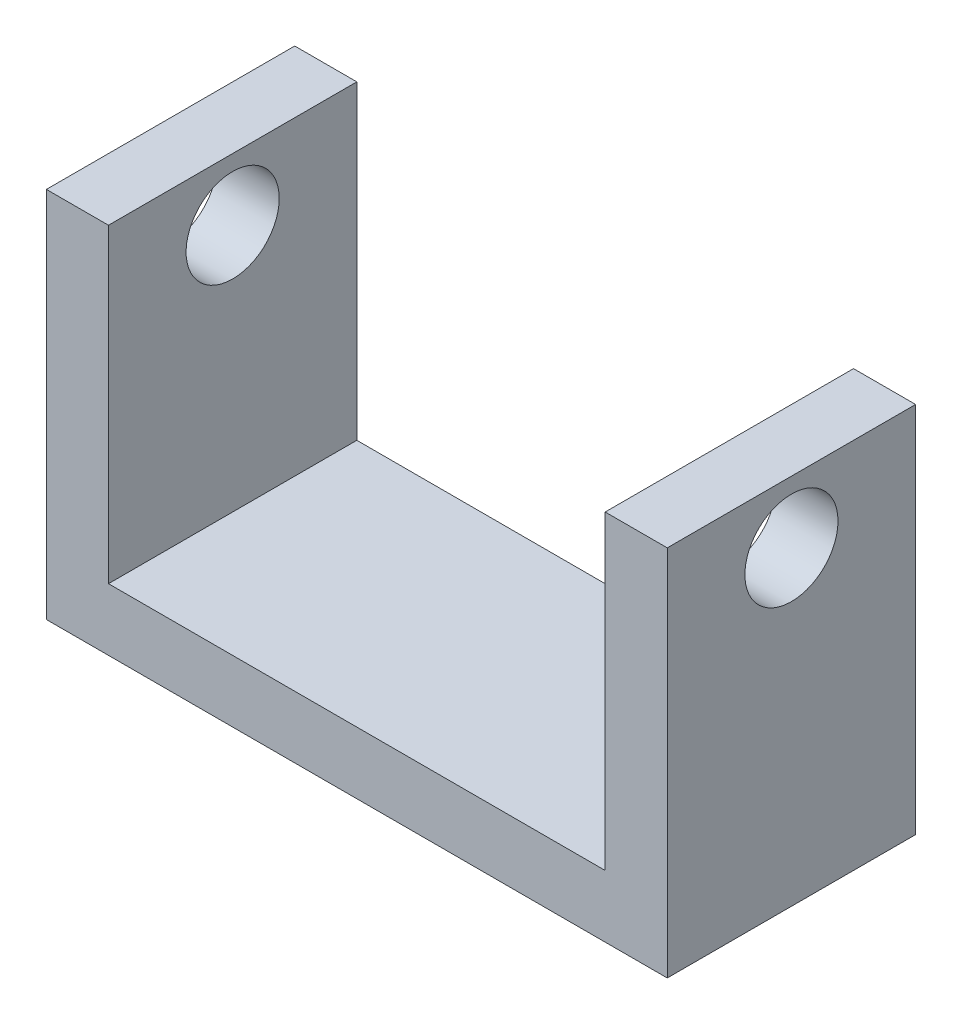
ISO-10303-21;
HEADER;
FILE_DESCRIPTION(('STEP AP214'),'2;1');
FILE_NAME('part.step','',(''),(''),'','','');
FILE_SCHEMA(('AUTOMOTIVE_DESIGN { 1 0 10303 214 1 1 1 1 }'));
ENDSEC;
DATA;
#1=APPLICATION_CONTEXT('core data for automotive mechanical design processes');
#2=APPLICATION_PROTOCOL_DEFINITION('international standard','automotive_design',2000,#1);
#3=PRODUCT_CONTEXT('',#1,'mechanical');
#4=PRODUCT('Part','Part','',(#3));
#5=PRODUCT_RELATED_PRODUCT_CATEGORY('part','',(#4));
#6=PRODUCT_DEFINITION_FORMATION('','',#4);
#7=PRODUCT_DEFINITION_CONTEXT('part definition',#1,'design');
#8=PRODUCT_DEFINITION('design','',#6,#7);
#9=PRODUCT_DEFINITION_SHAPE('','',#8);
#10=(LENGTH_UNIT() NAMED_UNIT(*) SI_UNIT(.MILLI.,.METRE.));
#11=(NAMED_UNIT(*) PLANE_ANGLE_UNIT() SI_UNIT($,.RADIAN.));
#12=(NAMED_UNIT(*) SI_UNIT($,.STERADIAN.) SOLID_ANGLE_UNIT());
#13=UNCERTAINTY_MEASURE_WITH_UNIT(LENGTH_MEASURE(1.E-05),#10,'distance_accuracy_value','');
#14=(GEOMETRIC_REPRESENTATION_CONTEXT(3) GLOBAL_UNCERTAINTY_ASSIGNED_CONTEXT((#13)) GLOBAL_UNIT_ASSIGNED_CONTEXT((#10,
#11,#12)) REPRESENTATION_CONTEXT('',''));
#15=CARTESIAN_POINT('',(0.,0.,0.));
#16=DIRECTION('',(0.,0.,1.));
#17=DIRECTION('',(1.,0.,0.));
#18=AXIS2_PLACEMENT_3D('',#15,#16,#17);
#19=CARTESIAN_POINT('',(31.75,0.,0.));
#20=DIRECTION('',(-1.,0.,0.));
#21=DIRECTION('',(0.,0.,1.));
#22=AXIS2_PLACEMENT_3D('',#19,#20,#21);
#23=PLANE('',#22);
#24=DIRECTION('',(0.,-1.,0.));
#25=VECTOR('',#24,1.);
#26=CARTESIAN_POINT('',(31.75,0.,0.));
#27=LINE('',#26,#25);
#28=CARTESIAN_POINT('',(31.75,19.05,0.));
#29=VERTEX_POINT('',#28);
#30=CARTESIAN_POINT('',(31.75,0.,0.));
#31=VERTEX_POINT('',#30);
#32=EDGE_CURVE('E146',#29,#31,#27,.T.);
#33=ORIENTED_EDGE('',*,*,#32,.T.);
#34=DIRECTION('',(0.,0.,-1.));
#35=VECTOR('',#34,1.);
#36=CARTESIAN_POINT('',(31.75,0.,0.));
#37=LINE('',#36,#35);
#38=CARTESIAN_POINT('',(31.75,0.,-12.7));
#39=VERTEX_POINT('',#38);
#40=EDGE_CURVE('E86',#31,#39,#37,.T.);
#41=ORIENTED_EDGE('',*,*,#40,.T.);
#42=DIRECTION('',(0.,1.,0.));
#43=VECTOR('',#42,1.);
#44=CARTESIAN_POINT('',(31.75,0.,-12.7));
#45=LINE('',#44,#43);
#46=CARTESIAN_POINT('',(31.75,19.05,-12.7));
#47=VERTEX_POINT('',#46);
#48=EDGE_CURVE('E150',#39,#47,#45,.T.);
#49=ORIENTED_EDGE('',*,*,#48,.T.);
#50=DIRECTION('',(0.,0.,1.));
#51=VECTOR('',#50,1.);
#52=CARTESIAN_POINT('',(31.75,19.05,0.));
#53=LINE('',#52,#51);
#54=EDGE_CURVE('E57',#47,#29,#53,.T.);
#55=ORIENTED_EDGE('',*,*,#54,.T.);
#56=EDGE_LOOP('',(#33,#41,#49,#55));
#57=FACE_BOUND('',#56,.T.);
#58=CARTESIAN_POINT('',(31.75,15.875,-6.35));
#59=DIRECTION('',(1.,0.,0.));
#60=DIRECTION('',(0.,0.,-1.));
#61=AXIS2_PLACEMENT_3D('',#58,#59,#60);
#62=CIRCLE('',#61,2.38125);
#63=CARTESIAN_POINT('',(31.75,15.875,-8.73125));
#64=VERTEX_POINT('',#63);
#65=EDGE_CURVE('E257',#64,#64,#62,.T.);
#66=ORIENTED_EDGE('',*,*,#65,.F.);
#67=EDGE_LOOP('',(#66));
#68=FACE_BOUND('',#67,.T.);
#69=ADVANCED_FACE('F32',(#57,#68),#23,.F.);
#70=CARTESIAN_POINT('',(0.,0.,0.));
#71=DIRECTION('',(-1.,0.,0.));
#72=DIRECTION('',(0.,0.,1.));
#73=AXIS2_PLACEMENT_3D('',#70,#71,#72);
#74=PLANE('',#73);
#75=DIRECTION('',(0.,-1.,0.));
#76=VECTOR('',#75,1.);
#77=CARTESIAN_POINT('',(0.,0.,0.));
#78=LINE('',#77,#76);
#79=CARTESIAN_POINT('',(0.,19.05,0.));
#80=VERTEX_POINT('',#79);
#81=CARTESIAN_POINT('',(0.,0.,0.));
#82=VERTEX_POINT('',#81);
#83=EDGE_CURVE('E125',#80,#82,#78,.T.);
#84=ORIENTED_EDGE('',*,*,#83,.F.);
#85=DIRECTION('',(0.,0.,1.));
#86=VECTOR('',#85,1.);
#87=CARTESIAN_POINT('',(0.,19.05,0.));
#88=LINE('',#87,#86);
#89=CARTESIAN_POINT('',(0.,19.05,-12.7));
#90=VERTEX_POINT('',#89);
#91=EDGE_CURVE('E148',#90,#80,#88,.T.);
#92=ORIENTED_EDGE('',*,*,#91,.F.);
#93=DIRECTION('',(0.,1.,0.));
#94=VECTOR('',#93,1.);
#95=CARTESIAN_POINT('',(0.,0.,-12.7));
#96=LINE('',#95,#94);
#97=CARTESIAN_POINT('',(0.,0.,-12.7));
#98=VERTEX_POINT('',#97);
#99=EDGE_CURVE('E156',#98,#90,#96,.T.);
#100=ORIENTED_EDGE('',*,*,#99,.F.);
#101=DIRECTION('',(0.,0.,-1.));
#102=VECTOR('',#101,1.);
#103=CARTESIAN_POINT('',(0.,0.,0.));
#104=LINE('',#103,#102);
#105=EDGE_CURVE('E154',#82,#98,#104,.T.);
#106=ORIENTED_EDGE('',*,*,#105,.F.);
#107=EDGE_LOOP('',(#84,#92,#100,#106));
#108=FACE_BOUND('',#107,.T.);
#109=CARTESIAN_POINT('',(0.,15.875,-6.35));
#110=DIRECTION('',(1.,0.,0.));
#111=DIRECTION('',(0.,0.,-1.));
#112=AXIS2_PLACEMENT_3D('',#109,#110,#111);
#113=CIRCLE('',#112,2.38124999999999);
#114=CARTESIAN_POINT('',(0.,15.875,-8.73124999999999));
#115=VERTEX_POINT('',#114);
#116=EDGE_CURVE('E259',#115,#115,#113,.T.);
#117=ORIENTED_EDGE('',*,*,#116,.T.);
#118=EDGE_LOOP('',(#117));
#119=FACE_BOUND('',#118,.T.);
#120=ADVANCED_FACE('F172',(#108,#119),#74,.T.);
#121=CARTESIAN_POINT('',(31.75,19.05,0.));
#122=DIRECTION('',(0.,-1.,0.));
#123=DIRECTION('',(0.,0.,-1.));
#124=AXIS2_PLACEMENT_3D('',#121,#122,#123);
#125=PLANE('',#124);
#126=DIRECTION('',(-1.,0.,0.));
#127=VECTOR('',#126,1.);
#128=CARTESIAN_POINT('',(31.75,19.05,0.));
#129=LINE('',#128,#127);
#130=CARTESIAN_POINT('',(3.175,19.05,0.));
#131=VERTEX_POINT('',#130);
#132=EDGE_CURVE('E79',#131,#80,#129,.T.);
#133=ORIENTED_EDGE('',*,*,#132,.F.);
#134=DIRECTION('',(0.,0.,1.));
#135=VECTOR('',#134,1.);
#136=CARTESIAN_POINT('',(3.175,19.05,-12.701));
#137=LINE('',#136,#135);
#138=CARTESIAN_POINT('',(3.175,19.05,-12.7));
#139=VERTEX_POINT('',#138);
#140=EDGE_CURVE('E126',#139,#131,#137,.T.);
#141=ORIENTED_EDGE('',*,*,#140,.F.);
#142=DIRECTION('',(-1.,0.,0.));
#143=VECTOR('',#142,1.);
#144=CARTESIAN_POINT('',(31.75,19.05,-12.7));
#145=LINE('',#144,#143);
#146=EDGE_CURVE('E131',#139,#90,#145,.T.);
#147=ORIENTED_EDGE('',*,*,#146,.T.);
#148=ORIENTED_EDGE('',*,*,#91,.T.);
#149=EDGE_LOOP('',(#133,#141,#147,#148));
#150=FACE_BOUND('',#149,.T.);
#151=ADVANCED_FACE('F175',(#150),#125,.F.);
#152=CARTESIAN_POINT('',(31.75,0.,0.));
#153=DIRECTION('',(0.,0.,-1.));
#154=DIRECTION('',(-1.,0.,0.));
#155=AXIS2_PLACEMENT_3D('',#152,#153,#154);
#156=PLANE('',#155);
#157=DIRECTION('',(1.,0.,0.));
#158=VECTOR('',#157,1.);
#159=CARTESIAN_POINT('',(3.175,3.175,0.));
#160=LINE('',#159,#158);
#161=CARTESIAN_POINT('',(3.175,3.175,0.));
#162=VERTEX_POINT('',#161);
#163=CARTESIAN_POINT('',(28.575,3.175,0.));
#164=VERTEX_POINT('',#163);
#165=EDGE_CURVE('E134',#162,#164,#160,.T.);
#166=ORIENTED_EDGE('',*,*,#165,.F.);
#167=DIRECTION('',(0.,-1.,0.));
#168=VECTOR('',#167,1.);
#169=CARTESIAN_POINT('',(3.175,19.05,0.));
#170=LINE('',#169,#168);
#171=EDGE_CURVE('E113',#131,#162,#170,.T.);
#172=ORIENTED_EDGE('',*,*,#171,.F.);
#173=ORIENTED_EDGE('',*,*,#132,.T.);
#174=ORIENTED_EDGE('',*,*,#83,.T.);
#175=DIRECTION('',(-1.,0.,0.));
#176=VECTOR('',#175,1.);
#177=CARTESIAN_POINT('',(31.75,0.,0.));
#178=LINE('',#177,#176);
#179=EDGE_CURVE('E11',#31,#82,#178,.T.);
#180=ORIENTED_EDGE('',*,*,#179,.F.);
#181=ORIENTED_EDGE('',*,*,#32,.F.);
#182=CARTESIAN_POINT('',(28.575,19.05,0.));
#183=VERTEX_POINT('',#182);
#184=EDGE_CURVE('E159',#29,#183,#129,.T.);
#185=ORIENTED_EDGE('',*,*,#184,.T.);
#186=DIRECTION('',(0.,1.,0.));
#187=VECTOR('',#186,1.);
#188=CARTESIAN_POINT('',(28.575,19.05,0.));
#189=LINE('',#188,#187);
#190=EDGE_CURVE('E48',#164,#183,#189,.T.);
#191=ORIENTED_EDGE('',*,*,#190,.F.);
#192=EDGE_LOOP('',(#166,#172,#173,#174,#180,#181,#185,#191));
#193=FACE_BOUND('',#192,.T.);
#194=ADVANCED_FACE('F34',(#193),#156,.F.);
#195=CARTESIAN_POINT('',(31.75,0.,0.));
#196=DIRECTION('',(0.,1.,0.));
#197=DIRECTION('',(0.,0.,1.));
#198=AXIS2_PLACEMENT_3D('',#195,#196,#197);
#199=PLANE('',#198);
#200=ORIENTED_EDGE('',*,*,#105,.T.);
#201=DIRECTION('',(-1.,0.,0.));
#202=VECTOR('',#201,1.);
#203=CARTESIAN_POINT('',(31.75,0.,-12.7));
#204=LINE('',#203,#202);
#205=EDGE_CURVE('E41',#39,#98,#204,.T.);
#206=ORIENTED_EDGE('',*,*,#205,.F.);
#207=ORIENTED_EDGE('',*,*,#40,.F.);
#208=ORIENTED_EDGE('',*,*,#179,.T.);
#209=EDGE_LOOP('',(#200,#206,#207,#208));
#210=FACE_BOUND('',#209,.T.);
#211=ADVANCED_FACE('F205',(#210),#199,.F.);
#212=CARTESIAN_POINT('',(31.75,0.,-12.7));
#213=DIRECTION('',(0.,0.,1.));
#214=DIRECTION('',(1.,0.,0.));
#215=AXIS2_PLACEMENT_3D('',#212,#213,#214);
#216=PLANE('',#215);
#217=ORIENTED_EDGE('',*,*,#146,.F.);
#218=DIRECTION('',(0.,1.,0.));
#219=VECTOR('',#218,1.);
#220=CARTESIAN_POINT('',(3.175,19.05,-12.7));
#221=LINE('',#220,#219);
#222=CARTESIAN_POINT('',(3.175,3.175,-12.7));
#223=VERTEX_POINT('',#222);
#224=EDGE_CURVE('E111',#223,#139,#221,.T.);
#225=ORIENTED_EDGE('',*,*,#224,.F.);
#226=DIRECTION('',(-1.,0.,0.));
#227=VECTOR('',#226,1.);
#228=CARTESIAN_POINT('',(3.175,3.175,-12.7));
#229=LINE('',#228,#227);
#230=CARTESIAN_POINT('',(28.575,3.175,-12.7));
#231=VERTEX_POINT('',#230);
#232=EDGE_CURVE('E120',#231,#223,#229,.T.);
#233=ORIENTED_EDGE('',*,*,#232,.F.);
#234=DIRECTION('',(0.,-1.,0.));
#235=VECTOR('',#234,1.);
#236=CARTESIAN_POINT('',(28.575,19.05,-12.7));
#237=LINE('',#236,#235);
#238=CARTESIAN_POINT('',(28.575,19.05,-12.7));
#239=VERTEX_POINT('',#238);
#240=EDGE_CURVE('E132',#239,#231,#237,.T.);
#241=ORIENTED_EDGE('',*,*,#240,.F.);
#242=EDGE_CURVE('E162',#47,#239,#145,.T.);
#243=ORIENTED_EDGE('',*,*,#242,.F.);
#244=ORIENTED_EDGE('',*,*,#48,.F.);
#245=ORIENTED_EDGE('',*,*,#205,.T.);
#246=ORIENTED_EDGE('',*,*,#99,.T.);
#247=EDGE_LOOP('',(#217,#225,#233,#241,#243,#244,#245,#246));
#248=FACE_BOUND('',#247,.T.);
#249=ADVANCED_FACE('F129',(#248),#216,.F.);
#250=ORIENTED_EDGE('',*,*,#242,.T.);
#251=DIRECTION('',(0.,0.,1.));
#252=VECTOR('',#251,1.);
#253=CARTESIAN_POINT('',(28.575,19.05,-12.701));
#254=LINE('',#253,#252);
#255=EDGE_CURVE('E143',#239,#183,#254,.T.);
#256=ORIENTED_EDGE('',*,*,#255,.T.);
#257=ORIENTED_EDGE('',*,*,#184,.F.);
#258=ORIENTED_EDGE('',*,*,#54,.F.);
#259=EDGE_LOOP('',(#250,#256,#257,#258));
#260=FACE_BOUND('',#259,.T.);
#261=ADVANCED_FACE('F179',(#260),#125,.F.);
#262=CARTESIAN_POINT('',(3.175,19.05,-12.701));
#263=DIRECTION('',(-1.,0.,0.));
#264=DIRECTION('',(0.,-1.,0.));
#265=AXIS2_PLACEMENT_3D('',#262,#263,#264);
#266=PLANE('',#265);
#267=CARTESIAN_POINT('',(3.175,15.875,-6.35));
#268=DIRECTION('',(-1.,0.,0.));
#269=DIRECTION('',(0.,-1.,0.));
#270=AXIS2_PLACEMENT_3D('',#267,#268,#269);
#271=CIRCLE('',#270,2.38124999999999);
#272=CARTESIAN_POINT('',(3.175,13.49375,-6.35));
#273=VERTEX_POINT('',#272);
#274=EDGE_CURVE('E136',#273,#273,#271,.T.);
#275=ORIENTED_EDGE('',*,*,#274,.T.);
#276=EDGE_LOOP('',(#275));
#277=FACE_BOUND('',#276,.T.);
#278=ORIENTED_EDGE('',*,*,#224,.T.);
#279=ORIENTED_EDGE('',*,*,#140,.T.);
#280=ORIENTED_EDGE('',*,*,#171,.T.);
#281=DIRECTION('',(0.,0.,1.));
#282=VECTOR('',#281,1.);
#283=CARTESIAN_POINT('',(3.175,3.175,-12.701));
#284=LINE('',#283,#282);
#285=EDGE_CURVE('E107',#223,#162,#284,.T.);
#286=ORIENTED_EDGE('',*,*,#285,.F.);
#287=EDGE_LOOP('',(#278,#279,#280,#286));
#288=FACE_BOUND('',#287,.T.);
#289=ADVANCED_FACE('F109',(#277,#288),#266,.F.);
#290=CARTESIAN_POINT('',(28.575,19.05,-12.701));
#291=DIRECTION('',(1.,0.,0.));
#292=DIRECTION('',(0.,1.,0.));
#293=AXIS2_PLACEMENT_3D('',#290,#291,#292);
#294=PLANE('',#293);
#295=CARTESIAN_POINT('',(28.575,15.875,-6.35));
#296=DIRECTION('',(1.,0.,0.));
#297=DIRECTION('',(0.,1.,0.));
#298=AXIS2_PLACEMENT_3D('',#295,#296,#297);
#299=CIRCLE('',#298,2.38124999999999);
#300=CARTESIAN_POINT('',(28.575,18.25625,-6.35));
#301=VERTEX_POINT('',#300);
#302=EDGE_CURVE('E36',#301,#301,#299,.T.);
#303=ORIENTED_EDGE('',*,*,#302,.T.);
#304=EDGE_LOOP('',(#303));
#305=FACE_BOUND('',#304,.T.);
#306=ORIENTED_EDGE('',*,*,#240,.T.);
#307=DIRECTION('',(0.,0.,1.));
#308=VECTOR('',#307,1.);
#309=CARTESIAN_POINT('',(28.575,3.175,-12.701));
#310=LINE('',#309,#308);
#311=EDGE_CURVE('E117',#231,#164,#310,.T.);
#312=ORIENTED_EDGE('',*,*,#311,.T.);
#313=ORIENTED_EDGE('',*,*,#190,.T.);
#314=ORIENTED_EDGE('',*,*,#255,.F.);
#315=EDGE_LOOP('',(#306,#312,#313,#314));
#316=FACE_BOUND('',#315,.T.);
#317=ADVANCED_FACE('F180',(#305,#316),#294,.F.);
#318=CARTESIAN_POINT('',(3.175,3.175,-12.701));
#319=DIRECTION('',(0.,-1.,0.));
#320=DIRECTION('',(1.,0.,0.));
#321=AXIS2_PLACEMENT_3D('',#318,#319,#320);
#322=PLANE('',#321);
#323=ORIENTED_EDGE('',*,*,#232,.T.);
#324=ORIENTED_EDGE('',*,*,#285,.T.);
#325=ORIENTED_EDGE('',*,*,#165,.T.);
#326=ORIENTED_EDGE('',*,*,#311,.F.);
#327=EDGE_LOOP('',(#323,#324,#325,#326));
#328=FACE_BOUND('',#327,.T.);
#329=ADVANCED_FACE('F121',(#328),#322,.F.);
#330=CARTESIAN_POINT('',(31.75,15.875,-6.35));
#331=DIRECTION('',(1.,0.,0.));
#332=DIRECTION('',(0.,0.,-1.));
#333=AXIS2_PLACEMENT_3D('',#330,#331,#332);
#334=CYLINDRICAL_SURFACE('',#333,2.38124999999999);
#335=ORIENTED_EDGE('',*,*,#116,.F.);
#336=EDGE_LOOP('',(#335));
#337=FACE_BOUND('',#336,.T.);
#338=ORIENTED_EDGE('',*,*,#274,.F.);
#339=EDGE_LOOP('',(#338));
#340=FACE_BOUND('',#339,.T.);
#341=ADVANCED_FACE('F188',(#337,#340),#334,.F.);
#342=ORIENTED_EDGE('',*,*,#65,.T.);
#343=EDGE_LOOP('',(#342));
#344=FACE_BOUND('',#343,.T.);
#345=ORIENTED_EDGE('',*,*,#302,.F.);
#346=EDGE_LOOP('',(#345));
#347=FACE_BOUND('',#346,.T.);
#348=ADVANCED_FACE('F242',(#344,#347),#334,.F.);
#349=CLOSED_SHELL('',(#69,#120,#151,#194,#211,#249,#261,#289,#317,#329,#341,#348));
#350=MANIFOLD_SOLID_BREP('B2',#349);
#351=ADVANCED_BREP_SHAPE_REPRESENTATION('',(#18,#350),#14);
#352=SHAPE_DEFINITION_REPRESENTATION(#9,#351);
ENDSEC;
END-ISO-10303-21;
